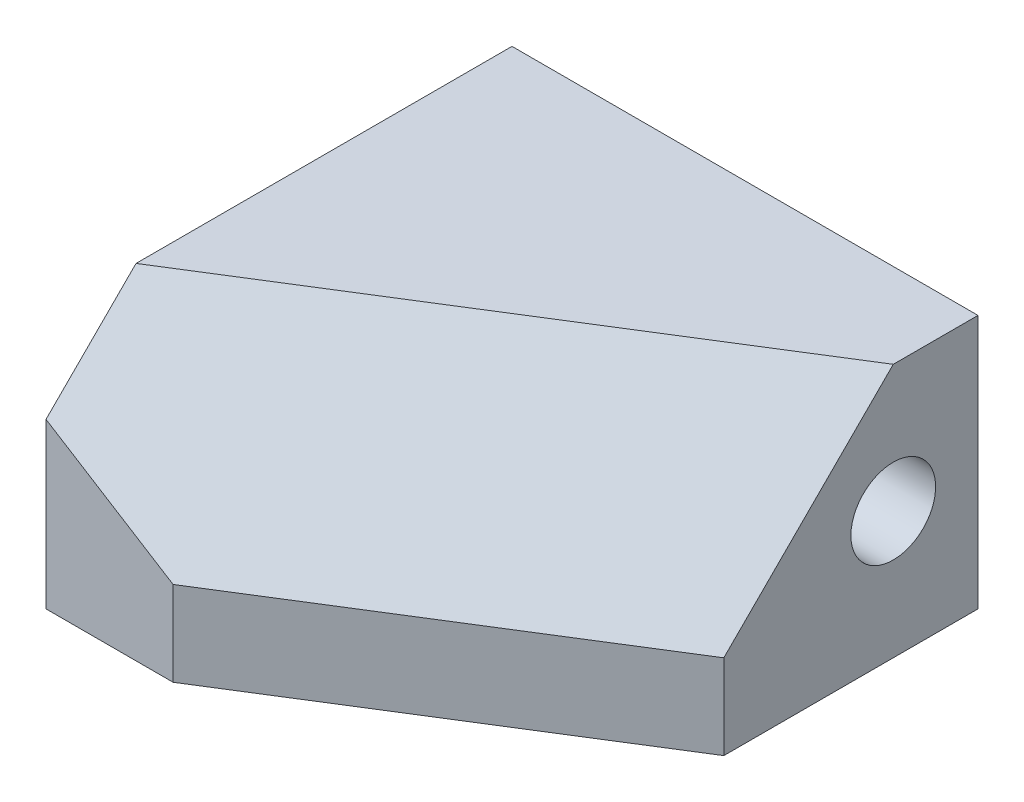
ISO-10303-21;
HEADER;
FILE_DESCRIPTION(('STEP AP214'),'2;1');
FILE_NAME('part.step','',(''),(''),'','','');
FILE_SCHEMA(('AUTOMOTIVE_DESIGN { 1 0 10303 214 1 1 1 1 }'));
ENDSEC;
DATA;
#1=APPLICATION_CONTEXT('core data for automotive mechanical design processes');
#2=APPLICATION_PROTOCOL_DEFINITION('international standard','automotive_design',2000,#1);
#3=PRODUCT_CONTEXT('',#1,'mechanical');
#4=PRODUCT('Part','Part','',(#3));
#5=PRODUCT_RELATED_PRODUCT_CATEGORY('part','',(#4));
#6=PRODUCT_DEFINITION_FORMATION('','',#4);
#7=PRODUCT_DEFINITION_CONTEXT('part definition',#1,'design');
#8=PRODUCT_DEFINITION('design','',#6,#7);
#9=PRODUCT_DEFINITION_SHAPE('','',#8);
#10=(LENGTH_UNIT() NAMED_UNIT(*) SI_UNIT(.MILLI.,.METRE.));
#11=(NAMED_UNIT(*) PLANE_ANGLE_UNIT() SI_UNIT($,.RADIAN.));
#12=(NAMED_UNIT(*) SI_UNIT($,.STERADIAN.) SOLID_ANGLE_UNIT());
#13=UNCERTAINTY_MEASURE_WITH_UNIT(LENGTH_MEASURE(1.E-05),#10,'distance_accuracy_value','');
#14=(GEOMETRIC_REPRESENTATION_CONTEXT(3) GLOBAL_UNCERTAINTY_ASSIGNED_CONTEXT((#13)) GLOBAL_UNIT_ASSIGNED_CONTEXT((#10,
#11,#12)) REPRESENTATION_CONTEXT('',''));
#15=CARTESIAN_POINT('',(0.,0.,0.));
#16=DIRECTION('',(0.,0.,1.));
#17=DIRECTION('',(1.,0.,0.));
#18=AXIS2_PLACEMENT_3D('',#15,#16,#17);
#19=CARTESIAN_POINT('',(7.84313725490196,12.5490196078431,12.5490196078431));
#20=DIRECTION('',(0.404226041727222,0.646761666763554,0.646761666763555));
#21=DIRECTION('',(0.,-0.707106781186548,0.707106781186547));
#22=AXIS2_PLACEMENT_3D('',#19,#20,#21);
#23=PLANE('',#22);
#24=DIRECTION('',(-0.847998304005088,0.,0.52999894000318));
#25=VECTOR('',#24,1.);
#26=CARTESIAN_POINT('',(0.,30.,0.));
#27=LINE('',#26,#25);
#28=CARTESIAN_POINT('',(0.,30.,0.));
#29=VERTEX_POINT('',#28);
#30=CARTESIAN_POINT('',(-55.,30.,34.375));
#31=VERTEX_POINT('',#30);
#32=EDGE_CURVE('E47',#29,#31,#27,.T.);
#33=ORIENTED_EDGE('',*,*,#32,.T.);
#34=DIRECTION('',(0.,-0.707106781186548,0.707106781186547));
#35=VECTOR('',#34,1.);
#36=CARTESIAN_POINT('',(-55.,24.6875,39.6875));
#37=LINE('',#36,#35);
#38=CARTESIAN_POINT('',(-55.,19.375,45.));
#39=VERTEX_POINT('',#38);
#40=EDGE_CURVE('E132',#31,#39,#37,.T.);
#41=ORIENTED_EDGE('',*,*,#40,.T.);
#42=DIRECTION('',(0.847998304005087,-0.529998940003181,0.));
#43=VECTOR('',#42,1.);
#44=CARTESIAN_POINT('',(-48.9887640449438,15.6179775280899,45.));
#45=LINE('',#44,#43);
#46=CARTESIAN_POINT('',(-40.,9.99999999999999,45.));
#47=VERTEX_POINT('',#46);
#48=EDGE_CURVE('E134',#39,#47,#45,.T.);
#49=ORIENTED_EDGE('',*,*,#48,.T.);
#50=DIRECTION('',(0.847998304005088,0.,-0.52999894000318));
#51=VECTOR('',#50,1.);
#52=CARTESIAN_POINT('',(0.,9.99999999999999,20.));
#53=LINE('',#52,#51);
#54=CARTESIAN_POINT('',(0.,10.,20.));
#55=VERTEX_POINT('',#54);
#56=EDGE_CURVE('E105',#47,#55,#53,.T.);
#57=ORIENTED_EDGE('',*,*,#56,.T.);
#58=DIRECTION('',(0.,0.707106781186548,-0.707106781186547));
#59=VECTOR('',#58,1.);
#60=CARTESIAN_POINT('',(0.,35.,-4.99999999999999));
#61=LINE('',#60,#59);
#62=EDGE_CURVE('E136',#55,#29,#61,.T.);
#63=ORIENTED_EDGE('',*,*,#62,.T.);
#64=EDGE_LOOP('',(#33,#41,#49,#57,#63));
#65=FACE_BOUND('',#64,.T.);
#66=ADVANCED_FACE('F44',(#65),#23,.T.);
#67=CARTESIAN_POINT('',(-55.,30.,45.));
#68=DIRECTION('',(1.,0.,0.));
#69=DIRECTION('',(0.,0.,-1.));
#70=AXIS2_PLACEMENT_3D('',#67,#68,#69);
#71=PLANE('',#70);
#72=CARTESIAN_POINT('',(-55.,15.,0.));
#73=DIRECTION('',(-1.,0.,0.));
#74=DIRECTION('',(0.,0.,1.));
#75=AXIS2_PLACEMENT_3D('',#72,#73,#74);
#76=CIRCLE('',#75,7.50000000000001);
#77=CARTESIAN_POINT('',(-55.,15.,7.50000000000001));
#78=VERTEX_POINT('',#77);
#79=EDGE_CURVE('E203',#78,#78,#76,.T.);
#80=ORIENTED_EDGE('',*,*,#79,.F.);
#81=EDGE_LOOP('',(#80));
#82=FACE_BOUND('',#81,.T.);
#83=ORIENTED_EDGE('',*,*,#40,.F.);
#84=DIRECTION('',(0.,0.,1.));
#85=VECTOR('',#84,1.);
#86=CARTESIAN_POINT('',(-55.,30.,45.));
#87=LINE('',#86,#85);
#88=CARTESIAN_POINT('',(-55.,30.,-10.));
#89=VERTEX_POINT('',#88);
#90=EDGE_CURVE('E124',#89,#31,#87,.T.);
#91=ORIENTED_EDGE('',*,*,#90,.F.);
#92=DIRECTION('',(0.,-1.,0.));
#93=VECTOR('',#92,1.);
#94=CARTESIAN_POINT('',(-55.,30.,-10.));
#95=LINE('',#94,#93);
#96=CARTESIAN_POINT('',(-55.,0.,-10.));
#97=VERTEX_POINT('',#96);
#98=EDGE_CURVE('E125',#89,#97,#95,.T.);
#99=ORIENTED_EDGE('',*,*,#98,.T.);
#100=DIRECTION('',(0.,0.,1.));
#101=VECTOR('',#100,1.);
#102=CARTESIAN_POINT('',(-55.,0.,45.));
#103=LINE('',#102,#101);
#104=CARTESIAN_POINT('',(-55.,0.,45.));
#105=VERTEX_POINT('',#104);
#106=EDGE_CURVE('E53',#97,#105,#103,.T.);
#107=ORIENTED_EDGE('',*,*,#106,.T.);
#108=DIRECTION('',(0.,-1.,0.));
#109=VECTOR('',#108,1.);
#110=CARTESIAN_POINT('',(-55.,30.,45.));
#111=LINE('',#110,#109);
#112=EDGE_CURVE('E83',#39,#105,#111,.T.);
#113=ORIENTED_EDGE('',*,*,#112,.F.);
#114=EDGE_LOOP('',(#83,#91,#99,#107,#113));
#115=FACE_BOUND('',#114,.T.);
#116=ADVANCED_FACE('F161',(#82,#115),#71,.F.);
#117=CARTESIAN_POINT('',(-40.,30.,45.));
#118=DIRECTION('',(0.,0.,-1.));
#119=DIRECTION('',(-1.,0.,0.));
#120=AXIS2_PLACEMENT_3D('',#117,#118,#119);
#121=PLANE('',#120);
#122=ORIENTED_EDGE('',*,*,#48,.F.);
#123=ORIENTED_EDGE('',*,*,#112,.T.);
#124=DIRECTION('',(1.,0.,0.));
#125=VECTOR('',#124,1.);
#126=CARTESIAN_POINT('',(-40.,0.,45.));
#127=LINE('',#126,#125);
#128=CARTESIAN_POINT('',(-40.,0.,45.));
#129=VERTEX_POINT('',#128);
#130=EDGE_CURVE('E111',#105,#129,#127,.T.);
#131=ORIENTED_EDGE('',*,*,#130,.T.);
#132=DIRECTION('',(0.,-1.,0.));
#133=VECTOR('',#132,1.);
#134=CARTESIAN_POINT('',(-40.,30.,45.));
#135=LINE('',#134,#133);
#136=EDGE_CURVE('E98',#47,#129,#135,.T.);
#137=ORIENTED_EDGE('',*,*,#136,.F.);
#138=EDGE_LOOP('',(#122,#123,#131,#137));
#139=FACE_BOUND('',#138,.T.);
#140=ADVANCED_FACE('F112',(#139),#121,.F.);
#141=CARTESIAN_POINT('',(0.,30.,20.));
#142=DIRECTION('',(-0.52999894000318,0.,-0.847998304005088));
#143=DIRECTION('',(-0.847998304005088,0.,0.52999894000318));
#144=AXIS2_PLACEMENT_3D('',#141,#142,#143);
#145=PLANE('',#144);
#146=ORIENTED_EDGE('',*,*,#56,.F.);
#147=ORIENTED_EDGE('',*,*,#136,.T.);
#148=DIRECTION('',(0.847998304005088,0.,-0.52999894000318));
#149=VECTOR('',#148,1.);
#150=CARTESIAN_POINT('',(0.,0.,20.));
#151=LINE('',#150,#149);
#152=CARTESIAN_POINT('',(0.,0.,20.));
#153=VERTEX_POINT('',#152);
#154=EDGE_CURVE('E103',#129,#153,#151,.T.);
#155=ORIENTED_EDGE('',*,*,#154,.T.);
#156=DIRECTION('',(0.,-1.,0.));
#157=VECTOR('',#156,1.);
#158=CARTESIAN_POINT('',(0.,30.,20.));
#159=LINE('',#158,#157);
#160=EDGE_CURVE('E109',#55,#153,#159,.T.);
#161=ORIENTED_EDGE('',*,*,#160,.F.);
#162=EDGE_LOOP('',(#146,#147,#155,#161));
#163=FACE_BOUND('',#162,.T.);
#164=ADVANCED_FACE('F100',(#163),#145,.F.);
#165=CARTESIAN_POINT('',(0.,30.,-10.));
#166=DIRECTION('',(-1.,0.,0.));
#167=DIRECTION('',(0.,0.,1.));
#168=AXIS2_PLACEMENT_3D('',#165,#166,#167);
#169=PLANE('',#168);
#170=CARTESIAN_POINT('',(0.,15.,0.));
#171=DIRECTION('',(-1.,0.,0.));
#172=DIRECTION('',(0.,0.,1.));
#173=AXIS2_PLACEMENT_3D('',#170,#171,#172);
#174=CIRCLE('',#173,5.00000000000001);
#175=CARTESIAN_POINT('',(0.,15.,5.00000000000001));
#176=VERTEX_POINT('',#175);
#177=EDGE_CURVE('E142',#176,#176,#174,.T.);
#178=ORIENTED_EDGE('',*,*,#177,.T.);
#179=EDGE_LOOP('',(#178));
#180=FACE_BOUND('',#179,.T.);
#181=ORIENTED_EDGE('',*,*,#62,.F.);
#182=ORIENTED_EDGE('',*,*,#160,.T.);
#183=DIRECTION('',(0.,0.,-1.));
#184=VECTOR('',#183,1.);
#185=CARTESIAN_POINT('',(0.,0.,-10.));
#186=LINE('',#185,#184);
#187=CARTESIAN_POINT('',(0.,0.,-10.));
#188=VERTEX_POINT('',#187);
#189=EDGE_CURVE('E116',#153,#188,#186,.T.);
#190=ORIENTED_EDGE('',*,*,#189,.T.);
#191=DIRECTION('',(0.,-1.,0.));
#192=VECTOR('',#191,1.);
#193=CARTESIAN_POINT('',(0.,30.,-10.));
#194=LINE('',#193,#192);
#195=CARTESIAN_POINT('',(0.,30.,-10.));
#196=VERTEX_POINT('',#195);
#197=EDGE_CURVE('E128',#196,#188,#194,.T.);
#198=ORIENTED_EDGE('',*,*,#197,.F.);
#199=DIRECTION('',(0.,0.,-1.));
#200=VECTOR('',#199,1.);
#201=CARTESIAN_POINT('',(0.,30.,0.));
#202=LINE('',#201,#200);
#203=EDGE_CURVE('E74',#29,#196,#202,.T.);
#204=ORIENTED_EDGE('',*,*,#203,.F.);
#205=EDGE_LOOP('',(#181,#182,#190,#198,#204));
#206=FACE_BOUND('',#205,.T.);
#207=ADVANCED_FACE('F160',(#180,#206),#169,.F.);
#208=CARTESIAN_POINT('',(0.,30.,0.));
#209=DIRECTION('',(0.,-1.,0.));
#210=DIRECTION('',(0.,0.,-1.));
#211=AXIS2_PLACEMENT_3D('',#208,#209,#210);
#212=PLANE('',#211);
#213=ORIENTED_EDGE('',*,*,#32,.F.);
#214=ORIENTED_EDGE('',*,*,#203,.T.);
#215=DIRECTION('',(-1.,0.,0.));
#216=VECTOR('',#215,1.);
#217=CARTESIAN_POINT('',(-55.,30.,-10.));
#218=LINE('',#217,#216);
#219=EDGE_CURVE('E118',#196,#89,#218,.T.);
#220=ORIENTED_EDGE('',*,*,#219,.T.);
#221=ORIENTED_EDGE('',*,*,#90,.T.);
#222=EDGE_LOOP('',(#213,#214,#220,#221));
#223=FACE_BOUND('',#222,.T.);
#224=ADVANCED_FACE('F164',(#223),#212,.F.);
#225=CARTESIAN_POINT('',(-55.,30.,-10.));
#226=DIRECTION('',(0.,0.,1.));
#227=DIRECTION('',(1.,0.,0.));
#228=AXIS2_PLACEMENT_3D('',#225,#226,#227);
#229=PLANE('',#228);
#230=DIRECTION('',(-1.,0.,0.));
#231=VECTOR('',#230,1.);
#232=CARTESIAN_POINT('',(-55.,0.,-10.));
#233=LINE('',#232,#231);
#234=EDGE_CURVE('E12',#188,#97,#233,.T.);
#235=ORIENTED_EDGE('',*,*,#234,.T.);
#236=ORIENTED_EDGE('',*,*,#98,.F.);
#237=ORIENTED_EDGE('',*,*,#219,.F.);
#238=ORIENTED_EDGE('',*,*,#197,.T.);
#239=EDGE_LOOP('',(#235,#236,#237,#238));
#240=FACE_BOUND('',#239,.T.);
#241=ADVANCED_FACE('F157',(#240),#229,.F.);
#242=CARTESIAN_POINT('',(0.,0.,0.));
#243=DIRECTION('',(0.,-1.,0.));
#244=DIRECTION('',(0.,0.,-1.));
#245=AXIS2_PLACEMENT_3D('',#242,#243,#244);
#246=PLANE('',#245);
#247=ORIENTED_EDGE('',*,*,#234,.F.);
#248=ORIENTED_EDGE('',*,*,#189,.F.);
#249=ORIENTED_EDGE('',*,*,#154,.F.);
#250=ORIENTED_EDGE('',*,*,#130,.F.);
#251=ORIENTED_EDGE('',*,*,#106,.F.);
#252=EDGE_LOOP('',(#247,#248,#249,#250,#251));
#253=FACE_BOUND('',#252,.T.);
#254=ADVANCED_FACE('F115',(#253),#246,.T.);
#255=CARTESIAN_POINT('',(-55.,15.,0.));
#256=DIRECTION('',(-1.,0.,0.));
#257=DIRECTION('',(0.,0.,1.));
#258=AXIS2_PLACEMENT_3D('',#255,#256,#257);
#259=CYLINDRICAL_SURFACE('',#258,5.00000000000001);
#260=ORIENTED_EDGE('',*,*,#177,.F.);
#261=EDGE_LOOP('',(#260));
#262=FACE_BOUND('',#261,.T.);
#263=CARTESIAN_POINT('',(-45.,15.,0.));
#264=DIRECTION('',(-1.,0.,0.));
#265=DIRECTION('',(0.,0.,1.));
#266=AXIS2_PLACEMENT_3D('',#263,#264,#265);
#267=CIRCLE('',#266,5.00000000000001);
#268=CARTESIAN_POINT('',(-45.,15.,5.00000000000001));
#269=VERTEX_POINT('',#268);
#270=EDGE_CURVE('E145',#269,#269,#267,.T.);
#271=ORIENTED_EDGE('',*,*,#270,.T.);
#272=EDGE_LOOP('',(#271));
#273=FACE_BOUND('',#272,.T.);
#274=ADVANCED_FACE('F182',(#262,#273),#259,.F.);
#275=CARTESIAN_POINT('',(-45.,20.,0.));
#276=DIRECTION('',(1.,0.,0.));
#277=DIRECTION('',(0.,0.,-1.));
#278=AXIS2_PLACEMENT_3D('',#275,#276,#277);
#279=PLANE('',#278);
#280=ORIENTED_EDGE('',*,*,#270,.F.);
#281=EDGE_LOOP('',(#280));
#282=FACE_BOUND('',#281,.T.);
#283=CARTESIAN_POINT('',(-45.,15.,0.));
#284=DIRECTION('',(-1.,0.,0.));
#285=DIRECTION('',(0.,0.,1.));
#286=AXIS2_PLACEMENT_3D('',#283,#284,#285);
#287=CIRCLE('',#286,7.50000000000001);
#288=CARTESIAN_POINT('',(-45.,15.,7.50000000000001));
#289=VERTEX_POINT('',#288);
#290=EDGE_CURVE('E150',#289,#289,#287,.T.);
#291=ORIENTED_EDGE('',*,*,#290,.T.);
#292=EDGE_LOOP('',(#291));
#293=FACE_BOUND('',#292,.T.);
#294=ADVANCED_FACE('F189',(#282,#293),#279,.F.);
#295=CARTESIAN_POINT('',(-55.,15.,0.));
#296=DIRECTION('',(-1.,0.,0.));
#297=DIRECTION('',(0.,0.,1.));
#298=AXIS2_PLACEMENT_3D('',#295,#296,#297);
#299=CYLINDRICAL_SURFACE('',#298,7.50000000000001);
#300=ORIENTED_EDGE('',*,*,#290,.F.);
#301=EDGE_LOOP('',(#300));
#302=FACE_BOUND('',#301,.T.);
#303=ORIENTED_EDGE('',*,*,#79,.T.);
#304=EDGE_LOOP('',(#303));
#305=FACE_BOUND('',#304,.T.);
#306=ADVANCED_FACE('F193',(#302,#305),#299,.F.);
#307=CLOSED_SHELL('',(#66,#116,#140,#164,#207,#224,#241,#254,#274,#294,#306));
#308=MANIFOLD_SOLID_BREP('B2',#307);
#309=ADVANCED_BREP_SHAPE_REPRESENTATION('',(#18,#308),#14);
#310=SHAPE_DEFINITION_REPRESENTATION(#9,#309);
ENDSEC;
END-ISO-10303-21;
